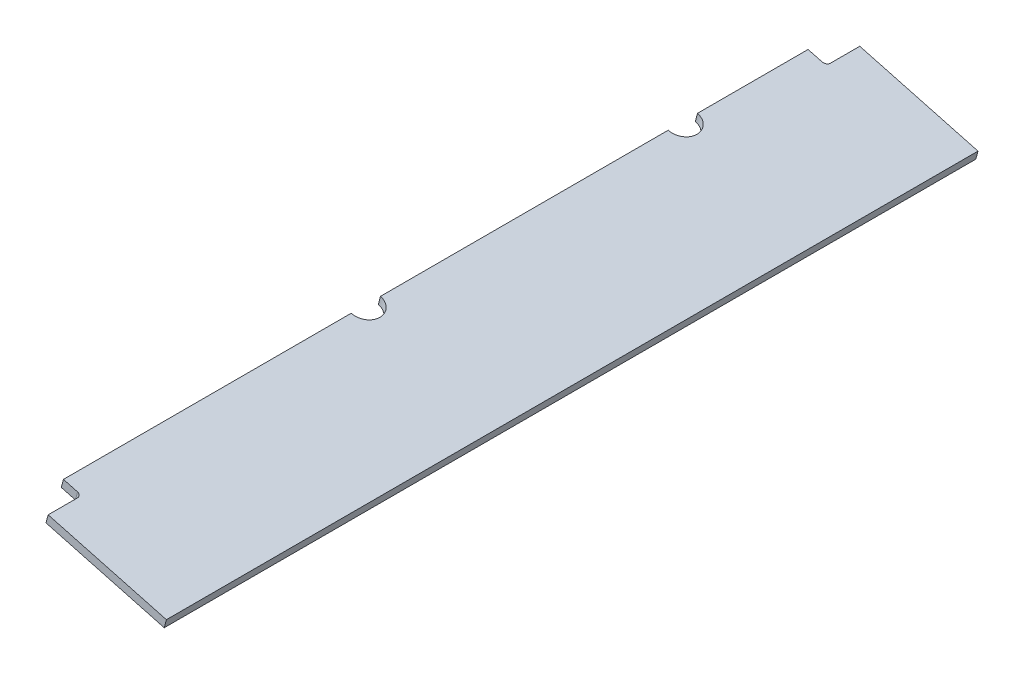
ISO-10303-21;
HEADER;
FILE_DESCRIPTION(('STEP AP214'),'2;1');
FILE_NAME('part.step','',(''),(''),'','','');
FILE_SCHEMA(('AUTOMOTIVE_DESIGN { 1 0 10303 214 1 1 1 1 }'));
ENDSEC;
DATA;
#1=APPLICATION_CONTEXT('core data for automotive mechanical design processes');
#2=APPLICATION_PROTOCOL_DEFINITION('international standard','automotive_design',2000,#1);
#3=PRODUCT_CONTEXT('',#1,'mechanical');
#4=PRODUCT('Part','Part','',(#3));
#5=PRODUCT_RELATED_PRODUCT_CATEGORY('part','',(#4));
#6=PRODUCT_DEFINITION_FORMATION('','',#4);
#7=PRODUCT_DEFINITION_CONTEXT('part definition',#1,'design');
#8=PRODUCT_DEFINITION('design','',#6,#7);
#9=PRODUCT_DEFINITION_SHAPE('','',#8);
#10=(LENGTH_UNIT() NAMED_UNIT(*) SI_UNIT(.MILLI.,.METRE.));
#11=(NAMED_UNIT(*) PLANE_ANGLE_UNIT() SI_UNIT($,.RADIAN.));
#12=(NAMED_UNIT(*) SI_UNIT($,.STERADIAN.) SOLID_ANGLE_UNIT());
#13=UNCERTAINTY_MEASURE_WITH_UNIT(LENGTH_MEASURE(1.E-05),#10,'distance_accuracy_value','');
#14=(GEOMETRIC_REPRESENTATION_CONTEXT(3) GLOBAL_UNCERTAINTY_ASSIGNED_CONTEXT((#13)) GLOBAL_UNIT_ASSIGNED_CONTEXT((#10,
#11,#12)) REPRESENTATION_CONTEXT('',''));
#15=CARTESIAN_POINT('',(0.,0.,0.));
#16=DIRECTION('',(0.,0.,1.));
#17=DIRECTION('',(1.,0.,0.));
#18=AXIS2_PLACEMENT_3D('',#15,#16,#17);
#19=CARTESIAN_POINT('',(25.6445635504698,67.7354146195812,1231.392));
#20=DIRECTION('',(0.965925828035116,-0.258819038586183,0.));
#21=DIRECTION('',(0.258819038586183,0.965925828035116,0.));
#22=AXIS2_PLACEMENT_3D('',#19,#20,#21);
#23=PLANE('',#22);
#24=DIRECTION('',(0.,0.,-1.));
#25=VECTOR('',#24,1.);
#26=CARTESIAN_POINT('',(22.3575617604253,55.4681566035353,1231.392));
#27=LINE('',#26,#25);
#28=CARTESIAN_POINT('',(22.3575617604253,55.4681566035353,218.567));
#29=VERTEX_POINT('',#28);
#30=CARTESIAN_POINT('',(22.3575617604254,55.4681566035353,50.8));
#31=VERTEX_POINT('',#30);
#32=EDGE_CURVE('E171',#29,#31,#27,.T.);
#33=ORIENTED_EDGE('',*,*,#32,.F.);
#34=DIRECTION('',(0.258819038586182,0.965925828035116,0.));
#35=VECTOR('',#34,1.);
#36=CARTESIAN_POINT('',(8.49052328274156,3.71566305777414,218.567));
#37=LINE('',#36,#35);
#38=CARTESIAN_POINT('',(25.6445635504698,67.7354146195812,218.567));
#39=VERTEX_POINT('',#38);
#40=EDGE_CURVE('E165',#29,#39,#37,.T.);
#41=ORIENTED_EDGE('',*,*,#40,.T.);
#42=DIRECTION('',(0.,0.,-1.));
#43=VECTOR('',#42,1.);
#44=CARTESIAN_POINT('',(25.6445635504698,67.7354146195812,1231.392));
#45=LINE('',#44,#43);
#46=CARTESIAN_POINT('',(25.6445635504699,67.7354146195812,50.8));
#47=VERTEX_POINT('',#46);
#48=EDGE_CURVE('E176',#39,#47,#45,.T.);
#49=ORIENTED_EDGE('',*,*,#48,.T.);
#50=DIRECTION('',(0.258819038586182,0.965925828035116,0.));
#51=VECTOR('',#50,1.);
#52=CARTESIAN_POINT('',(8.49052328274158,3.71566305777414,50.8));
#53=LINE('',#52,#51);
#54=EDGE_CURVE('E231',#31,#47,#53,.T.);
#55=ORIENTED_EDGE('',*,*,#54,.F.);
#56=EDGE_LOOP('',(#33,#41,#49,#55));
#57=FACE_BOUND('',#56,.T.);
#58=ADVANCED_FACE('F33',(#57),#23,.F.);
#59=CARTESIAN_POINT('',(25.6445635504698,67.7354146195812,699.5795));
#60=VERTEX_POINT('',#59);
#61=CARTESIAN_POINT('',(25.6445635504698,67.7354146195812,263.017));
#62=VERTEX_POINT('',#61);
#63=EDGE_CURVE('E179',#60,#62,#45,.T.);
#64=ORIENTED_EDGE('',*,*,#63,.T.);
#65=DIRECTION('',(0.258819038586182,0.965925828035116,0.));
#66=VECTOR('',#65,1.);
#67=CARTESIAN_POINT('',(8.49052328274156,3.71566305777414,263.017));
#68=LINE('',#67,#66);
#69=CARTESIAN_POINT('',(22.3575617604253,55.4681566035353,263.017));
#70=VERTEX_POINT('',#69);
#71=EDGE_CURVE('E246',#62,#70,#68,.F.);
#72=ORIENTED_EDGE('',*,*,#71,.T.);
#73=CARTESIAN_POINT('',(22.3575617604253,55.4681566035353,699.5795));
#74=VERTEX_POINT('',#73);
#75=EDGE_CURVE('E174',#74,#70,#27,.T.);
#76=ORIENTED_EDGE('',*,*,#75,.F.);
#77=DIRECTION('',(0.258819038586182,0.965925828035116,0.));
#78=VECTOR('',#77,1.);
#79=CARTESIAN_POINT('',(8.49052328274156,3.71566305777414,699.5795));
#80=LINE('',#79,#78);
#81=EDGE_CURVE('E243',#74,#60,#80,.T.);
#82=ORIENTED_EDGE('',*,*,#81,.T.);
#83=EDGE_LOOP('',(#64,#72,#76,#82));
#84=FACE_BOUND('',#83,.T.);
#85=ADVANCED_FACE('F257',(#84),#23,.F.);
#86=CARTESIAN_POINT('',(229.367540781201,1.3965340208432E-06,1231.392));
#87=DIRECTION('',(-0.965925828035116,0.258819038586183,0.));
#88=DIRECTION('',(-0.258819038586183,-0.965925828035116,0.));
#89=AXIS2_PLACEMENT_3D('',#86,#87,#88);
#90=PLANE('',#89);
#91=DIRECTION('',(0.258819038586183,0.965925828035116,0.));
#92=VECTOR('',#91,1.);
#93=CARTESIAN_POINT('',(229.367540781201,1.3965340208432E-06,0.));
#94=LINE('',#93,#92);
#95=CARTESIAN_POINT('',(229.367540781201,1.3965340208432E-06,0.));
#96=VERTEX_POINT('',#95);
#97=CARTESIAN_POINT('',(232.654542571246,12.2672594125801,0.));
#98=VERTEX_POINT('',#97);
#99=EDGE_CURVE('E161',#96,#98,#94,.T.);
#100=ORIENTED_EDGE('',*,*,#99,.T.);
#101=DIRECTION('',(0.,0.,-1.));
#102=VECTOR('',#101,1.);
#103=CARTESIAN_POINT('',(232.654542571246,12.2672594125801,1231.392));
#104=LINE('',#103,#102);
#105=CARTESIAN_POINT('',(232.654542571246,12.2672594125801,1231.392));
#106=VERTEX_POINT('',#105);
#107=EDGE_CURVE('E181',#106,#98,#104,.T.);
#108=ORIENTED_EDGE('',*,*,#107,.F.);
#109=DIRECTION('',(0.258819038586183,0.965925828035116,0.));
#110=VECTOR('',#109,1.);
#111=CARTESIAN_POINT('',(229.367540781201,1.3965340208432E-06,1231.392));
#112=LINE('',#111,#110);
#113=CARTESIAN_POINT('',(229.367540781201,1.3965340208432E-06,1231.392));
#114=VERTEX_POINT('',#113);
#115=EDGE_CURVE('E151',#114,#106,#112,.T.);
#116=ORIENTED_EDGE('',*,*,#115,.F.);
#117=DIRECTION('',(0.,0.,-1.));
#118=VECTOR('',#117,1.);
#119=CARTESIAN_POINT('',(229.367540781201,1.3965340208432E-06,1231.392));
#120=LINE('',#119,#118);
#121=EDGE_CURVE('E155',#114,#96,#120,.T.);
#122=ORIENTED_EDGE('',*,*,#121,.T.);
#123=EDGE_LOOP('',(#100,#108,#116,#122));
#124=FACE_BOUND('',#123,.T.);
#125=ADVANCED_FACE('F287',(#124),#90,.F.);
#126=CARTESIAN_POINT('',(232.654542571246,12.2672594125801,1231.392));
#127=DIRECTION('',(-0.258819038586182,-0.965925828035116,0.));
#128=DIRECTION('',(0.965925828035116,-0.258819038586182,0.));
#129=AXIS2_PLACEMENT_3D('',#126,#127,#128);
#130=PLANE('',#129);
#131=CARTESIAN_POINT('',(25.6445635504698,67.7354146195812,1180.592));
#132=VERTEX_POINT('',#131);
#133=CARTESIAN_POINT('',(25.6445635504698,67.7354146195812,744.0295));
#134=VERTEX_POINT('',#133);
#135=EDGE_CURVE('E180',#132,#134,#45,.T.);
#136=ORIENTED_EDGE('',*,*,#135,.F.);
#137=DIRECTION('',(-0.965925828035116,0.258819038586182,0.));
#138=VECTOR('',#137,1.);
#139=CARTESIAN_POINT('',(25.6445635504698,67.7354146195812,1180.592));
#140=LINE('',#139,#138);
#141=CARTESIAN_POINT('',(47.1122650785505,61.9831614870033,1180.592));
#142=VERTEX_POINT('',#141);
#143=EDGE_CURVE('E146',#142,#132,#140,.T.);
#144=ORIENTED_EDGE('',*,*,#143,.F.);
#145=CARTESIAN_POINT('',(47.1122650785505,61.9831614870033,1186.942));
#146=DIRECTION('',(-0.258819038586182,-0.965925828035116,0.));
#147=DIRECTION('',(0.965925828035116,-0.258819038586182,0.));
#148=AXIS2_PLACEMENT_3D('',#145,#146,#147);
#149=CIRCLE('',#148,6.35);
#150=CARTESIAN_POINT('',(53.2458940865735,60.339660591981,1186.942));
#151=VERTEX_POINT('',#150);
#152=EDGE_CURVE('E41',#142,#151,#149,.T.);
#153=ORIENTED_EDGE('',*,*,#152,.T.);
#154=DIRECTION('',(0.,0.,-1.));
#155=VECTOR('',#154,1.);
#156=CARTESIAN_POINT('',(53.2458940865735,60.339660591981,1231.392));
#157=LINE('',#156,#155);
#158=CARTESIAN_POINT('',(53.2458940865735,60.339660591981,1231.392));
#159=VERTEX_POINT('',#158);
#160=EDGE_CURVE('E133',#159,#151,#157,.T.);
#161=ORIENTED_EDGE('',*,*,#160,.F.);
#162=DIRECTION('',(-0.965925828035116,0.258819038586182,0.));
#163=VECTOR('',#162,1.);
#164=CARTESIAN_POINT('',(232.654542571246,12.2672594125801,1231.392));
#165=LINE('',#164,#163);
#166=EDGE_CURVE('E144',#106,#159,#165,.T.);
#167=ORIENTED_EDGE('',*,*,#166,.F.);
#168=ORIENTED_EDGE('',*,*,#107,.T.);
#169=DIRECTION('',(-0.965925828035116,0.258819038586182,0.));
#170=VECTOR('',#169,1.);
#171=CARTESIAN_POINT('',(232.654542571246,12.2672594125801,0.));
#172=LINE('',#171,#170);
#173=CARTESIAN_POINT('',(53.2458940865733,60.3396605919811,0.));
#174=VERTEX_POINT('',#173);
#175=EDGE_CURVE('E164',#98,#174,#172,.T.);
#176=ORIENTED_EDGE('',*,*,#175,.T.);
#177=DIRECTION('',(0.,0.,-1.));
#178=VECTOR('',#177,1.);
#179=CARTESIAN_POINT('',(53.2458940865733,60.3396605919811,0.));
#180=LINE('',#179,#178);
#181=CARTESIAN_POINT('',(53.2458940865733,60.3396605919811,44.45));
#182=VERTEX_POINT('',#181);
#183=EDGE_CURVE('E227',#182,#174,#180,.T.);
#184=ORIENTED_EDGE('',*,*,#183,.F.);
#185=CARTESIAN_POINT('',(47.1122650785503,61.9831614870033,44.45));
#186=DIRECTION('',(-0.258819038586182,-0.965925828035116,0.));
#187=DIRECTION('',(0.965925828035116,-0.258819038586182,0.));
#188=AXIS2_PLACEMENT_3D('',#185,#186,#187);
#189=CIRCLE('',#188,6.35);
#190=CARTESIAN_POINT('',(47.1122650785503,61.9831614870033,50.8));
#191=VERTEX_POINT('',#190);
#192=EDGE_CURVE('E204',#182,#191,#189,.T.);
#193=ORIENTED_EDGE('',*,*,#192,.T.);
#194=DIRECTION('',(0.965925828035116,-0.258819038586182,0.));
#195=VECTOR('',#194,1.);
#196=CARTESIAN_POINT('',(25.6445635504699,67.7354146195812,50.8));
#197=LINE('',#196,#195);
#198=EDGE_CURVE('E226',#47,#191,#197,.T.);
#199=ORIENTED_EDGE('',*,*,#198,.F.);
#200=ORIENTED_EDGE('',*,*,#48,.F.);
#201=CARTESIAN_POINT('',(25.6445635504698,67.7354146195812,240.792));
#202=DIRECTION('',(0.258819038586182,0.965925828035116,0.));
#203=DIRECTION('',(-0.965925828035116,0.258819038586182,0.));
#204=AXIS2_PLACEMENT_3D('',#201,#202,#203);
#205=CIRCLE('',#204,22.225);
#206=EDGE_CURVE('E232',#62,#39,#205,.T.);
#207=ORIENTED_EDGE('',*,*,#206,.F.);
#208=ORIENTED_EDGE('',*,*,#63,.F.);
#209=CARTESIAN_POINT('',(25.6445635504698,67.7354146195812,721.8045));
#210=DIRECTION('',(0.258819038586182,0.965925828035116,0.));
#211=DIRECTION('',(-0.965925828035116,0.258819038586182,0.));
#212=AXIS2_PLACEMENT_3D('',#209,#210,#211);
#213=CIRCLE('',#212,22.225);
#214=EDGE_CURVE('E147',#134,#60,#213,.T.);
#215=ORIENTED_EDGE('',*,*,#214,.F.);
#216=EDGE_LOOP('',(#136,#144,#153,#161,#167,#168,#176,#184,#193,#199,#200,#207,#208,#215));
#217=FACE_BOUND('',#216,.T.);
#218=ADVANCED_FACE('F142',(#217),#130,.F.);
#219=CARTESIAN_POINT('',(22.3575617604254,55.4681566035353,1180.592));
#220=VERTEX_POINT('',#219);
#221=CARTESIAN_POINT('',(22.3575617604253,55.4681566035353,744.0295));
#222=VERTEX_POINT('',#221);
#223=EDGE_CURVE('E175',#220,#222,#27,.T.);
#224=ORIENTED_EDGE('',*,*,#223,.F.);
#225=DIRECTION('',(0.258819038586182,0.965925828035116,0.));
#226=VECTOR('',#225,1.);
#227=CARTESIAN_POINT('',(8.49052328274157,3.71566305777414,1180.592));
#228=LINE('',#227,#226);
#229=EDGE_CURVE('E220',#220,#132,#228,.T.);
#230=ORIENTED_EDGE('',*,*,#229,.T.);
#231=ORIENTED_EDGE('',*,*,#135,.T.);
#232=DIRECTION('',(0.258819038586182,0.965925828035116,0.));
#233=VECTOR('',#232,1.);
#234=CARTESIAN_POINT('',(8.49052328274156,3.71566305777414,744.0295));
#235=LINE('',#234,#233);
#236=EDGE_CURVE('E240',#134,#222,#235,.F.);
#237=ORIENTED_EDGE('',*,*,#236,.T.);
#238=EDGE_LOOP('',(#224,#230,#231,#237));
#239=FACE_BOUND('',#238,.T.);
#240=ADVANCED_FACE('F264',(#239),#23,.F.);
#241=CARTESIAN_POINT('',(229.367540781201,1.3965340208432E-06,1231.392));
#242=DIRECTION('',(0.258819038586183,0.965925828035116,0.));
#243=DIRECTION('',(-0.965925828035116,0.258819038586183,0.));
#244=AXIS2_PLACEMENT_3D('',#241,#242,#243);
#245=PLANE('',#244);
#246=DIRECTION('',(0.,0.,-1.));
#247=VECTOR('',#246,1.);
#248=CARTESIAN_POINT('',(49.9588922965289,48.0724025759351,1231.392));
#249=LINE('',#248,#247);
#250=CARTESIAN_POINT('',(49.958892296529,48.0724025759351,1231.392));
#251=VERTEX_POINT('',#250);
#252=CARTESIAN_POINT('',(49.9588922965289,48.0724025759351,1186.942));
#253=VERTEX_POINT('',#252);
#254=EDGE_CURVE('E134',#251,#253,#249,.T.);
#255=ORIENTED_EDGE('',*,*,#254,.T.);
#256=CARTESIAN_POINT('',(43.825263288506,49.7159034709573,1186.942));
#257=DIRECTION('',(0.258819038586183,0.965925828035116,0.));
#258=DIRECTION('',(-0.965925828035116,0.258819038586183,0.));
#259=AXIS2_PLACEMENT_3D('',#256,#257,#258);
#260=CIRCLE('',#259,6.35);
#261=CARTESIAN_POINT('',(43.8252632885059,49.7159034709573,1180.592));
#262=VERTEX_POINT('',#261);
#263=EDGE_CURVE('E11',#253,#262,#260,.T.);
#264=ORIENTED_EDGE('',*,*,#263,.T.);
#265=DIRECTION('',(-0.965925828035116,0.258819038586183,0.));
#266=VECTOR('',#265,1.);
#267=CARTESIAN_POINT('',(229.367540781201,1.3965340208432E-06,1180.592));
#268=LINE('',#267,#266);
#269=EDGE_CURVE('E193',#262,#220,#268,.T.);
#270=ORIENTED_EDGE('',*,*,#269,.T.);
#271=ORIENTED_EDGE('',*,*,#223,.T.);
#272=CARTESIAN_POINT('',(22.3575617604253,55.4681566035353,721.8045));
#273=DIRECTION('',(0.258819038586183,0.965925828035116,0.));
#274=DIRECTION('',(-0.965925828035116,0.258819038586183,0.));
#275=AXIS2_PLACEMENT_3D('',#272,#273,#274);
#276=CIRCLE('',#275,22.225);
#277=EDGE_CURVE('E138',#222,#74,#276,.T.);
#278=ORIENTED_EDGE('',*,*,#277,.T.);
#279=ORIENTED_EDGE('',*,*,#75,.T.);
#280=CARTESIAN_POINT('',(22.3575617604253,55.4681566035353,240.792));
#281=DIRECTION('',(0.258819038586183,0.965925828035116,0.));
#282=DIRECTION('',(-0.965925828035116,0.258819038586183,0.));
#283=AXIS2_PLACEMENT_3D('',#280,#281,#282);
#284=CIRCLE('',#283,22.225);
#285=EDGE_CURVE('E190',#70,#29,#284,.T.);
#286=ORIENTED_EDGE('',*,*,#285,.T.);
#287=ORIENTED_EDGE('',*,*,#32,.T.);
#288=DIRECTION('',(0.965925828035116,-0.258819038586183,0.));
#289=VECTOR('',#288,1.);
#290=CARTESIAN_POINT('',(229.367540781201,1.3965340208432E-06,50.8));
#291=LINE('',#290,#289);
#292=CARTESIAN_POINT('',(43.8252632885058,49.7159034709574,50.8));
#293=VERTEX_POINT('',#292);
#294=EDGE_CURVE('E187',#31,#293,#291,.T.);
#295=ORIENTED_EDGE('',*,*,#294,.T.);
#296=CARTESIAN_POINT('',(43.8252632885058,49.7159034709574,44.45));
#297=DIRECTION('',(0.258819038586183,0.965925828035116,0.));
#298=DIRECTION('',(-0.965925828035116,0.258819038586183,0.));
#299=AXIS2_PLACEMENT_3D('',#296,#297,#298);
#300=CIRCLE('',#299,6.35);
#301=CARTESIAN_POINT('',(49.9588922965288,48.0724025759351,44.4499999999999));
#302=VERTEX_POINT('',#301);
#303=EDGE_CURVE('E206',#293,#302,#300,.T.);
#304=ORIENTED_EDGE('',*,*,#303,.T.);
#305=DIRECTION('',(0.,0.,-1.));
#306=VECTOR('',#305,1.);
#307=CARTESIAN_POINT('',(49.9588922965288,48.0724025759351,1231.392));
#308=LINE('',#307,#306);
#309=CARTESIAN_POINT('',(49.9588922965288,48.0724025759351,0.));
#310=VERTEX_POINT('',#309);
#311=EDGE_CURVE('E211',#302,#310,#308,.T.);
#312=ORIENTED_EDGE('',*,*,#311,.T.);
#313=DIRECTION('',(0.965925828035116,-0.258819038586183,0.));
#314=VECTOR('',#313,1.);
#315=CARTESIAN_POINT('',(229.367540781201,1.3965340208432E-06,0.));
#316=LINE('',#315,#314);
#317=EDGE_CURVE('E157',#310,#96,#316,.T.);
#318=ORIENTED_EDGE('',*,*,#317,.T.);
#319=ORIENTED_EDGE('',*,*,#121,.F.);
#320=DIRECTION('',(0.965925828035116,-0.258819038586183,0.));
#321=VECTOR('',#320,1.);
#322=CARTESIAN_POINT('',(229.367540781201,1.3965340208432E-06,1231.392));
#323=LINE('',#322,#321);
#324=EDGE_CURVE('E153',#251,#114,#323,.T.);
#325=ORIENTED_EDGE('',*,*,#324,.F.);
#326=EDGE_LOOP('',(#255,#264,#270,#271,#278,#279,#286,#287,#295,#304,#312,#318,#319,#325));
#327=FACE_BOUND('',#326,.T.);
#328=ADVANCED_FACE('F210',(#327),#245,.F.);
#329=CARTESIAN_POINT('',(0.,0.,1231.392));
#330=DIRECTION('',(0.,0.,1.));
#331=DIRECTION('',(1.,0.,0.));
#332=AXIS2_PLACEMENT_3D('',#329,#330,#331);
#333=PLANE('',#332);
#334=DIRECTION('',(0.258819038586182,0.965925828035116,0.));
#335=VECTOR('',#334,1.);
#336=CARTESIAN_POINT('',(34.5941808905174,-9.2694825822948,1231.392));
#337=LINE('',#336,#335);
#338=EDGE_CURVE('E131',#251,#159,#337,.T.);
#339=ORIENTED_EDGE('',*,*,#338,.F.);
#340=ORIENTED_EDGE('',*,*,#324,.T.);
#341=ORIENTED_EDGE('',*,*,#115,.T.);
#342=ORIENTED_EDGE('',*,*,#166,.T.);
#343=EDGE_LOOP('',(#339,#340,#341,#342));
#344=FACE_BOUND('',#343,.T.);
#345=ADVANCED_FACE('F149',(#344),#333,.T.);
#346=CARTESIAN_POINT('',(0.,0.,0.));
#347=DIRECTION('',(0.,0.,1.));
#348=DIRECTION('',(1.,0.,0.));
#349=AXIS2_PLACEMENT_3D('',#346,#347,#348);
#350=PLANE('',#349);
#351=ORIENTED_EDGE('',*,*,#317,.F.);
#352=DIRECTION('',(0.258819038586182,0.965925828035116,0.));
#353=VECTOR('',#352,1.);
#354=CARTESIAN_POINT('',(34.5941808905172,-9.26948258229475,0.));
#355=LINE('',#354,#353);
#356=EDGE_CURVE('E139',#310,#174,#355,.T.);
#357=ORIENTED_EDGE('',*,*,#356,.T.);
#358=ORIENTED_EDGE('',*,*,#175,.F.);
#359=ORIENTED_EDGE('',*,*,#99,.F.);
#360=EDGE_LOOP('',(#351,#357,#358,#359));
#361=FACE_BOUND('',#360,.T.);
#362=ADVANCED_FACE('F305',(#361),#350,.F.);
#363=CARTESIAN_POINT('',(8.49052328274158,3.71566305777414,50.8));
#364=DIRECTION('',(0.,0.,1.));
#365=DIRECTION('',(1.,0.,0.));
#366=AXIS2_PLACEMENT_3D('',#363,#364,#365);
#367=PLANE('',#366);
#368=ORIENTED_EDGE('',*,*,#198,.T.);
#369=DIRECTION('',(0.258819038586182,0.965925828035116,0.));
#370=VECTOR('',#369,1.);
#371=CARTESIAN_POINT('',(43.8252632885058,49.7159034709574,50.8));
#372=LINE('',#371,#370);
#373=EDGE_CURVE('E198',#191,#293,#372,.F.);
#374=ORIENTED_EDGE('',*,*,#373,.T.);
#375=ORIENTED_EDGE('',*,*,#294,.F.);
#376=ORIENTED_EDGE('',*,*,#54,.T.);
#377=EDGE_LOOP('',(#368,#374,#375,#376));
#378=FACE_BOUND('',#377,.T.);
#379=ADVANCED_FACE('F229',(#378),#367,.F.);
#380=CARTESIAN_POINT('',(36.091853818845,-3.68009096982602,0.));
#381=DIRECTION('',(0.965925828035116,-0.258819038586182,0.));
#382=DIRECTION('',(0.258819038586182,0.965925828035116,0.));
#383=AXIS2_PLACEMENT_3D('',#380,#381,#382);
#384=PLANE('',#383);
#385=ORIENTED_EDGE('',*,*,#311,.F.);
#386=DIRECTION('',(0.258819038586182,0.965925828035116,0.));
#387=VECTOR('',#386,1.);
#388=CARTESIAN_POINT('',(53.2458940865733,60.3396605919811,44.45));
#389=LINE('',#388,#387);
#390=EDGE_CURVE('E195',#302,#182,#389,.T.);
#391=ORIENTED_EDGE('',*,*,#390,.T.);
#392=ORIENTED_EDGE('',*,*,#183,.T.);
#393=ORIENTED_EDGE('',*,*,#356,.F.);
#394=EDGE_LOOP('',(#385,#391,#392,#393));
#395=FACE_BOUND('',#394,.T.);
#396=ADVANCED_FACE('F217',(#395),#384,.F.);
#397=CARTESIAN_POINT('',(8.49052328274157,3.71566305777414,1180.592));
#398=DIRECTION('',(0.,0.,-1.));
#399=DIRECTION('',(-1.,0.,0.));
#400=AXIS2_PLACEMENT_3D('',#397,#398,#399);
#401=PLANE('',#400);
#402=ORIENTED_EDGE('',*,*,#269,.F.);
#403=DIRECTION('',(0.258819038586182,0.965925828035116,0.));
#404=VECTOR('',#403,1.);
#405=CARTESIAN_POINT('',(47.1122650785505,61.9831614870033,1180.592));
#406=LINE('',#405,#404);
#407=EDGE_CURVE('E200',#262,#142,#406,.T.);
#408=ORIENTED_EDGE('',*,*,#407,.T.);
#409=ORIENTED_EDGE('',*,*,#143,.T.);
#410=ORIENTED_EDGE('',*,*,#229,.F.);
#411=EDGE_LOOP('',(#402,#408,#409,#410));
#412=FACE_BOUND('',#411,.T.);
#413=ADVANCED_FACE('F273',(#412),#401,.F.);
#414=CARTESIAN_POINT('',(36.0918538188452,-3.68009096982606,1231.392));
#415=DIRECTION('',(0.965925828035116,-0.258819038586182,0.));
#416=DIRECTION('',(0.258819038586182,0.965925828035116,0.));
#417=AXIS2_PLACEMENT_3D('',#414,#415,#416);
#418=PLANE('',#417);
#419=ORIENTED_EDGE('',*,*,#160,.T.);
#420=DIRECTION('',(0.258819038586182,0.965925828035116,0.));
#421=VECTOR('',#420,1.);
#422=CARTESIAN_POINT('',(49.9588922965289,48.0724025759351,1186.942));
#423=LINE('',#422,#421);
#424=EDGE_CURVE('E48',#151,#253,#423,.F.);
#425=ORIENTED_EDGE('',*,*,#424,.T.);
#426=ORIENTED_EDGE('',*,*,#254,.F.);
#427=ORIENTED_EDGE('',*,*,#338,.T.);
#428=EDGE_LOOP('',(#419,#425,#426,#427));
#429=FACE_BOUND('',#428,.T.);
#430=ADVANCED_FACE('F132',(#429),#418,.F.);
#431=CARTESIAN_POINT('',(8.49052328274157,3.71566305777414,721.8045));
#432=DIRECTION('',(0.258819038586182,0.965925828035116,0.));
#433=DIRECTION('',(-0.965925828035116,0.258819038586182,0.));
#434=AXIS2_PLACEMENT_3D('',#431,#432,#433);
#435=CYLINDRICAL_SURFACE('',#434,22.225);
#436=ORIENTED_EDGE('',*,*,#277,.F.);
#437=ORIENTED_EDGE('',*,*,#236,.F.);
#438=ORIENTED_EDGE('',*,*,#214,.T.);
#439=ORIENTED_EDGE('',*,*,#81,.F.);
#440=EDGE_LOOP('',(#436,#437,#438,#439));
#441=FACE_BOUND('',#440,.T.);
#442=ADVANCED_FACE('F268',(#441),#435,.F.);
#443=CARTESIAN_POINT('',(8.49052328274157,3.71566305777414,240.792));
#444=DIRECTION('',(0.258819038586182,0.965925828035116,0.));
#445=DIRECTION('',(-0.965925828035116,0.258819038586182,0.));
#446=AXIS2_PLACEMENT_3D('',#443,#444,#445);
#447=CYLINDRICAL_SURFACE('',#446,22.225);
#448=ORIENTED_EDGE('',*,*,#285,.F.);
#449=ORIENTED_EDGE('',*,*,#71,.F.);
#450=ORIENTED_EDGE('',*,*,#206,.T.);
#451=ORIENTED_EDGE('',*,*,#40,.F.);
#452=EDGE_LOOP('',(#448,#449,#450,#451));
#453=FACE_BOUND('',#452,.T.);
#454=ADVANCED_FACE('F281',(#453),#447,.F.);
#455=CARTESIAN_POINT('',(29.958224810822,-2.03659007480376,44.45));
#456=DIRECTION('',(-0.258819038586182,-0.965925828035116,0.));
#457=DIRECTION('',(0.965925828035116,-0.258819038586182,0.));
#458=AXIS2_PLACEMENT_3D('',#455,#456,#457);
#459=CYLINDRICAL_SURFACE('',#458,6.35);
#460=ORIENTED_EDGE('',*,*,#303,.F.);
#461=ORIENTED_EDGE('',*,*,#373,.F.);
#462=ORIENTED_EDGE('',*,*,#192,.F.);
#463=ORIENTED_EDGE('',*,*,#390,.F.);
#464=EDGE_LOOP('',(#460,#461,#462,#463));
#465=FACE_BOUND('',#464,.T.);
#466=ADVANCED_FACE('F222',(#465),#459,.F.);
#467=CARTESIAN_POINT('',(29.9582248108222,-2.03659007480381,1186.942));
#468=DIRECTION('',(-0.258819038586182,-0.965925828035116,0.));
#469=DIRECTION('',(0.965925828035116,-0.258819038586182,0.));
#470=AXIS2_PLACEMENT_3D('',#467,#468,#469);
#471=CYLINDRICAL_SURFACE('',#470,6.35);
#472=ORIENTED_EDGE('',*,*,#263,.F.);
#473=ORIENTED_EDGE('',*,*,#424,.F.);
#474=ORIENTED_EDGE('',*,*,#152,.F.);
#475=ORIENTED_EDGE('',*,*,#407,.F.);
#476=EDGE_LOOP('',(#472,#473,#474,#475));
#477=FACE_BOUND('',#476,.T.);
#478=ADVANCED_FACE('F35',(#477),#471,.F.);
#479=CLOSED_SHELL('',(#58,#85,#125,#218,#240,#328,#345,#362,#379,#396,#413,#430,#442,#454,#466,#478));
#480=MANIFOLD_SOLID_BREP('B2',#479);
#481=ADVANCED_BREP_SHAPE_REPRESENTATION('',(#18,#480),#14);
#482=SHAPE_DEFINITION_REPRESENTATION(#9,#481);
ENDSEC;
END-ISO-10303-21;
